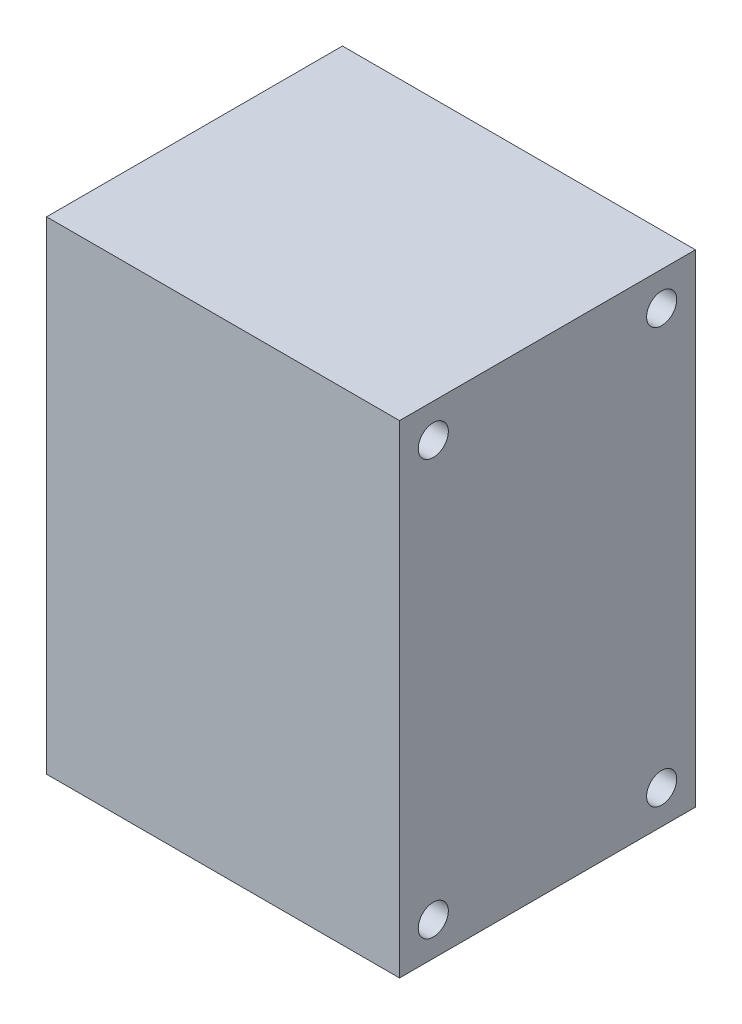
ISO-10303-21;
HEADER;
FILE_DESCRIPTION(('STEP AP214'),'2;1');
FILE_NAME('part.step','',(''),(''),'','','');
FILE_SCHEMA(('AUTOMOTIVE_DESIGN { 1 0 10303 214 1 1 1 1 }'));
ENDSEC;
DATA;
#1=APPLICATION_CONTEXT('core data for automotive mechanical design processes');
#2=APPLICATION_PROTOCOL_DEFINITION('international standard','automotive_design',2000,#1);
#3=PRODUCT_CONTEXT('',#1,'mechanical');
#4=PRODUCT('Part','Part','',(#3));
#5=PRODUCT_RELATED_PRODUCT_CATEGORY('part','',(#4));
#6=PRODUCT_DEFINITION_FORMATION('','',#4);
#7=PRODUCT_DEFINITION_CONTEXT('part definition',#1,'design');
#8=PRODUCT_DEFINITION('design','',#6,#7);
#9=PRODUCT_DEFINITION_SHAPE('','',#8);
#10=(LENGTH_UNIT() NAMED_UNIT(*) SI_UNIT(.MILLI.,.METRE.));
#11=(NAMED_UNIT(*) PLANE_ANGLE_UNIT() SI_UNIT($,.RADIAN.));
#12=(NAMED_UNIT(*) SI_UNIT($,.STERADIAN.) SOLID_ANGLE_UNIT());
#13=UNCERTAINTY_MEASURE_WITH_UNIT(LENGTH_MEASURE(1.E-05),#10,'distance_accuracy_value','');
#14=(GEOMETRIC_REPRESENTATION_CONTEXT(3) GLOBAL_UNCERTAINTY_ASSIGNED_CONTEXT((#13)) GLOBAL_UNIT_ASSIGNED_CONTEXT((#10,
#11,#12)) REPRESENTATION_CONTEXT('',''));
#15=CARTESIAN_POINT('',(0.,0.,0.));
#16=DIRECTION('',(0.,0.,1.));
#17=DIRECTION('',(1.,0.,0.));
#18=AXIS2_PLACEMENT_3D('',#15,#16,#17);
#19=CARTESIAN_POINT('',(17.,23.25,28.5));
#20=DIRECTION('',(-1.,0.,0.));
#21=DIRECTION('',(0.,-1.,0.));
#22=AXIS2_PLACEMENT_3D('',#19,#20,#21);
#23=PLANE('',#22);
#24=CARTESIAN_POINT('',(17.,-20.,25.2499999999996));
#25=DIRECTION('',(1.,0.,0.));
#26=DIRECTION('',(0.,1.,0.));
#27=AXIS2_PLACEMENT_3D('',#24,#25,#26);
#28=CIRCLE('',#27,1.45);
#29=CARTESIAN_POINT('',(17.,-18.55,25.2499999999996));
#30=VERTEX_POINT('',#29);
#31=EDGE_CURVE('E146',#30,#30,#28,.T.);
#32=ORIENTED_EDGE('',*,*,#31,.F.);
#33=EDGE_LOOP('',(#32));
#34=FACE_BOUND('',#33,.T.);
#35=CARTESIAN_POINT('',(17.,-20.,3.24999999999959));
#36=DIRECTION('',(1.,0.,0.));
#37=DIRECTION('',(0.,1.,0.));
#38=AXIS2_PLACEMENT_3D('',#35,#36,#37);
#39=CIRCLE('',#38,1.45);
#40=CARTESIAN_POINT('',(17.,-18.55,3.24999999999959));
#41=VERTEX_POINT('',#40);
#42=EDGE_CURVE('E154',#41,#41,#39,.T.);
#43=ORIENTED_EDGE('',*,*,#42,.F.);
#44=EDGE_LOOP('',(#43));
#45=FACE_BOUND('',#44,.T.);
#46=CARTESIAN_POINT('',(17.,20.,3.25));
#47=DIRECTION('',(1.,0.,0.));
#48=DIRECTION('',(0.,1.,0.));
#49=AXIS2_PLACEMENT_3D('',#46,#47,#48);
#50=CIRCLE('',#49,1.45);
#51=CARTESIAN_POINT('',(17.,21.45,3.25));
#52=VERTEX_POINT('',#51);
#53=EDGE_CURVE('E138',#52,#52,#50,.T.);
#54=ORIENTED_EDGE('',*,*,#53,.F.);
#55=EDGE_LOOP('',(#54));
#56=FACE_BOUND('',#55,.T.);
#57=CARTESIAN_POINT('',(17.,20.,25.25));
#58=DIRECTION('',(1.,0.,0.));
#59=DIRECTION('',(0.,1.,0.));
#60=AXIS2_PLACEMENT_3D('',#57,#58,#59);
#61=CIRCLE('',#60,1.45);
#62=CARTESIAN_POINT('',(17.,21.45,25.25));
#63=VERTEX_POINT('',#62);
#64=EDGE_CURVE('E134',#63,#63,#61,.T.);
#65=ORIENTED_EDGE('',*,*,#64,.F.);
#66=EDGE_LOOP('',(#65));
#67=FACE_BOUND('',#66,.T.);
#68=DIRECTION('',(0.,1.,0.));
#69=VECTOR('',#68,1.);
#70=CARTESIAN_POINT('',(17.,23.25,0.));
#71=LINE('',#70,#69);
#72=CARTESIAN_POINT('',(17.,-23.25,0.));
#73=VERTEX_POINT('',#72);
#74=CARTESIAN_POINT('',(17.,23.25,0.));
#75=VERTEX_POINT('',#74);
#76=EDGE_CURVE('E113',#73,#75,#71,.T.);
#77=ORIENTED_EDGE('',*,*,#76,.T.);
#78=DIRECTION('',(0.,0.,-1.));
#79=VECTOR('',#78,1.);
#80=CARTESIAN_POINT('',(17.,23.25,28.5));
#81=LINE('',#80,#79);
#82=CARTESIAN_POINT('',(17.,23.25,28.5));
#83=VERTEX_POINT('',#82);
#84=EDGE_CURVE('E11',#83,#75,#81,.T.);
#85=ORIENTED_EDGE('',*,*,#84,.F.);
#86=DIRECTION('',(0.,1.,0.));
#87=VECTOR('',#86,1.);
#88=CARTESIAN_POINT('',(17.,23.25,28.5));
#89=LINE('',#88,#87);
#90=CARTESIAN_POINT('',(17.,-23.25,28.5));
#91=VERTEX_POINT('',#90);
#92=EDGE_CURVE('E97',#91,#83,#89,.T.);
#93=ORIENTED_EDGE('',*,*,#92,.F.);
#94=DIRECTION('',(0.,0.,-1.));
#95=VECTOR('',#94,1.);
#96=CARTESIAN_POINT('',(17.,-23.25,28.5));
#97=LINE('',#96,#95);
#98=EDGE_CURVE('E109',#91,#73,#97,.T.);
#99=ORIENTED_EDGE('',*,*,#98,.T.);
#100=EDGE_LOOP('',(#77,#85,#93,#99));
#101=FACE_BOUND('',#100,.T.);
#102=ADVANCED_FACE('F45',(#34,#45,#56,#67,#101),#23,.F.);
#103=CARTESIAN_POINT('',(-17.,23.25,28.5));
#104=DIRECTION('',(0.,-1.,0.));
#105=DIRECTION('',(0.,0.,-1.));
#106=AXIS2_PLACEMENT_3D('',#103,#104,#105);
#107=PLANE('',#106);
#108=DIRECTION('',(-1.,0.,0.));
#109=VECTOR('',#108,1.);
#110=CARTESIAN_POINT('',(-17.,23.25,0.));
#111=LINE('',#110,#109);
#112=CARTESIAN_POINT('',(-17.,23.25,0.));
#113=VERTEX_POINT('',#112);
#114=EDGE_CURVE('E102',#75,#113,#111,.T.);
#115=ORIENTED_EDGE('',*,*,#114,.T.);
#116=DIRECTION('',(0.,0.,-1.));
#117=VECTOR('',#116,1.);
#118=CARTESIAN_POINT('',(-17.,23.25,28.5));
#119=LINE('',#118,#117);
#120=CARTESIAN_POINT('',(-17.,23.25,28.5));
#121=VERTEX_POINT('',#120);
#122=EDGE_CURVE('E54',#121,#113,#119,.T.);
#123=ORIENTED_EDGE('',*,*,#122,.F.);
#124=DIRECTION('',(-1.,0.,0.));
#125=VECTOR('',#124,1.);
#126=CARTESIAN_POINT('',(-17.,23.25,28.5));
#127=LINE('',#126,#125);
#128=EDGE_CURVE('E92',#83,#121,#127,.T.);
#129=ORIENTED_EDGE('',*,*,#128,.F.);
#130=ORIENTED_EDGE('',*,*,#84,.T.);
#131=EDGE_LOOP('',(#115,#123,#129,#130));
#132=FACE_BOUND('',#131,.T.);
#133=ADVANCED_FACE('F101',(#132),#107,.F.);
#134=CARTESIAN_POINT('',(-17.,23.25,28.5));
#135=DIRECTION('',(1.,0.,0.));
#136=DIRECTION('',(0.,1.,0.));
#137=AXIS2_PLACEMENT_3D('',#134,#135,#136);
#138=PLANE('',#137);
#139=CARTESIAN_POINT('',(-17.,-20.,25.2499999999996));
#140=DIRECTION('',(1.,0.,0.));
#141=DIRECTION('',(0.,1.,0.));
#142=AXIS2_PLACEMENT_3D('',#139,#140,#141);
#143=CIRCLE('',#142,1.45);
#144=CARTESIAN_POINT('',(-17.,-18.55,25.2499999999996));
#145=VERTEX_POINT('',#144);
#146=EDGE_CURVE('E142',#145,#145,#143,.T.);
#147=ORIENTED_EDGE('',*,*,#146,.T.);
#148=EDGE_LOOP('',(#147));
#149=FACE_BOUND('',#148,.T.);
#150=CARTESIAN_POINT('',(-17.,-20.,3.24999999999959));
#151=DIRECTION('',(1.,0.,0.));
#152=DIRECTION('',(0.,1.,0.));
#153=AXIS2_PLACEMENT_3D('',#150,#151,#152);
#154=CIRCLE('',#153,1.45);
#155=CARTESIAN_POINT('',(-17.,-18.55,3.24999999999959));
#156=VERTEX_POINT('',#155);
#157=EDGE_CURVE('E150',#156,#156,#154,.T.);
#158=ORIENTED_EDGE('',*,*,#157,.T.);
#159=EDGE_LOOP('',(#158));
#160=FACE_BOUND('',#159,.T.);
#161=CARTESIAN_POINT('',(-17.,20.,3.25));
#162=DIRECTION('',(1.,0.,0.));
#163=DIRECTION('',(0.,1.,0.));
#164=AXIS2_PLACEMENT_3D('',#161,#162,#163);
#165=CIRCLE('',#164,1.45);
#166=CARTESIAN_POINT('',(-17.,21.45,3.25));
#167=VERTEX_POINT('',#166);
#168=EDGE_CURVE('E158',#167,#167,#165,.T.);
#169=ORIENTED_EDGE('',*,*,#168,.T.);
#170=EDGE_LOOP('',(#169));
#171=FACE_BOUND('',#170,.T.);
#172=CARTESIAN_POINT('',(-17.,20.,25.25));
#173=DIRECTION('',(1.,0.,0.));
#174=DIRECTION('',(0.,1.,0.));
#175=AXIS2_PLACEMENT_3D('',#172,#173,#174);
#176=CIRCLE('',#175,1.45);
#177=CARTESIAN_POINT('',(-17.,21.45,25.25));
#178=VERTEX_POINT('',#177);
#179=EDGE_CURVE('E117',#178,#178,#176,.T.);
#180=ORIENTED_EDGE('',*,*,#179,.T.);
#181=EDGE_LOOP('',(#180));
#182=FACE_BOUND('',#181,.T.);
#183=DIRECTION('',(0.,-1.,0.));
#184=VECTOR('',#183,1.);
#185=CARTESIAN_POINT('',(-17.,23.25,0.));
#186=LINE('',#185,#184);
#187=CARTESIAN_POINT('',(-17.,-23.25,0.));
#188=VERTEX_POINT('',#187);
#189=EDGE_CURVE('E79',#113,#188,#186,.T.);
#190=ORIENTED_EDGE('',*,*,#189,.T.);
#191=DIRECTION('',(0.,0.,-1.));
#192=VECTOR('',#191,1.);
#193=CARTESIAN_POINT('',(-17.,-23.25,28.5));
#194=LINE('',#193,#192);
#195=CARTESIAN_POINT('',(-17.,-23.25,28.5));
#196=VERTEX_POINT('',#195);
#197=EDGE_CURVE('E104',#196,#188,#194,.T.);
#198=ORIENTED_EDGE('',*,*,#197,.F.);
#199=DIRECTION('',(0.,-1.,0.));
#200=VECTOR('',#199,1.);
#201=CARTESIAN_POINT('',(-17.,23.25,28.5));
#202=LINE('',#201,#200);
#203=EDGE_CURVE('E95',#121,#196,#202,.T.);
#204=ORIENTED_EDGE('',*,*,#203,.F.);
#205=ORIENTED_EDGE('',*,*,#122,.T.);
#206=EDGE_LOOP('',(#190,#198,#204,#205));
#207=FACE_BOUND('',#206,.T.);
#208=ADVANCED_FACE('F105',(#149,#160,#171,#182,#207),#138,.F.);
#209=CARTESIAN_POINT('',(-17.,-23.25,28.5));
#210=DIRECTION('',(0.,1.,0.));
#211=DIRECTION('',(0.,0.,1.));
#212=AXIS2_PLACEMENT_3D('',#209,#210,#211);
#213=PLANE('',#212);
#214=DIRECTION('',(1.,0.,0.));
#215=VECTOR('',#214,1.);
#216=CARTESIAN_POINT('',(-17.,-23.25,0.));
#217=LINE('',#216,#215);
#218=EDGE_CURVE('E85',#188,#73,#217,.T.);
#219=ORIENTED_EDGE('',*,*,#218,.T.);
#220=ORIENTED_EDGE('',*,*,#98,.F.);
#221=DIRECTION('',(1.,0.,0.));
#222=VECTOR('',#221,1.);
#223=CARTESIAN_POINT('',(-17.,-23.25,28.5));
#224=LINE('',#223,#222);
#225=EDGE_CURVE('E62',#196,#91,#224,.T.);
#226=ORIENTED_EDGE('',*,*,#225,.F.);
#227=ORIENTED_EDGE('',*,*,#197,.T.);
#228=EDGE_LOOP('',(#219,#220,#226,#227));
#229=FACE_BOUND('',#228,.T.);
#230=ADVANCED_FACE('F127',(#229),#213,.F.);
#231=CARTESIAN_POINT('',(0.,0.,28.5));
#232=DIRECTION('',(0.,0.,1.));
#233=DIRECTION('',(1.,0.,0.));
#234=AXIS2_PLACEMENT_3D('',#231,#232,#233);
#235=PLANE('',#234);
#236=ORIENTED_EDGE('',*,*,#92,.T.);
#237=ORIENTED_EDGE('',*,*,#128,.T.);
#238=ORIENTED_EDGE('',*,*,#203,.T.);
#239=ORIENTED_EDGE('',*,*,#225,.T.);
#240=EDGE_LOOP('',(#236,#237,#238,#239));
#241=FACE_BOUND('',#240,.T.);
#242=ADVANCED_FACE('F93',(#241),#235,.T.);
#243=CARTESIAN_POINT('',(0.,0.,0.));
#244=DIRECTION('',(0.,0.,1.));
#245=DIRECTION('',(1.,0.,0.));
#246=AXIS2_PLACEMENT_3D('',#243,#244,#245);
#247=PLANE('',#246);
#248=ORIENTED_EDGE('',*,*,#76,.F.);
#249=ORIENTED_EDGE('',*,*,#218,.F.);
#250=ORIENTED_EDGE('',*,*,#189,.F.);
#251=ORIENTED_EDGE('',*,*,#114,.F.);
#252=EDGE_LOOP('',(#248,#249,#250,#251));
#253=FACE_BOUND('',#252,.T.);
#254=ADVANCED_FACE('F130',(#253),#247,.F.);
#255=CARTESIAN_POINT('',(-17.,20.,25.25));
#256=DIRECTION('',(1.,0.,0.));
#257=DIRECTION('',(0.,1.,0.));
#258=AXIS2_PLACEMENT_3D('',#255,#256,#257);
#259=CYLINDRICAL_SURFACE('',#258,1.45);
#260=ORIENTED_EDGE('',*,*,#179,.F.);
#261=EDGE_LOOP('',(#260));
#262=FACE_BOUND('',#261,.T.);
#263=ORIENTED_EDGE('',*,*,#64,.T.);
#264=EDGE_LOOP('',(#263));
#265=FACE_BOUND('',#264,.T.);
#266=ADVANCED_FACE('F173',(#262,#265),#259,.F.);
#267=CARTESIAN_POINT('',(-17.,20.,3.25));
#268=DIRECTION('',(1.,0.,0.));
#269=DIRECTION('',(0.,1.,0.));
#270=AXIS2_PLACEMENT_3D('',#267,#268,#269);
#271=CYLINDRICAL_SURFACE('',#270,1.45);
#272=ORIENTED_EDGE('',*,*,#168,.F.);
#273=EDGE_LOOP('',(#272));
#274=FACE_BOUND('',#273,.T.);
#275=ORIENTED_EDGE('',*,*,#53,.T.);
#276=EDGE_LOOP('',(#275));
#277=FACE_BOUND('',#276,.T.);
#278=ADVANCED_FACE('F166',(#274,#277),#271,.F.);
#279=CARTESIAN_POINT('',(-17.,-20.,3.24999999999959));
#280=DIRECTION('',(1.,0.,0.));
#281=DIRECTION('',(0.,1.,0.));
#282=AXIS2_PLACEMENT_3D('',#279,#280,#281);
#283=CYLINDRICAL_SURFACE('',#282,1.45);
#284=ORIENTED_EDGE('',*,*,#157,.F.);
#285=EDGE_LOOP('',(#284));
#286=FACE_BOUND('',#285,.T.);
#287=ORIENTED_EDGE('',*,*,#42,.T.);
#288=EDGE_LOOP('',(#287));
#289=FACE_BOUND('',#288,.T.);
#290=ADVANCED_FACE('F181',(#286,#289),#283,.F.);
#291=CARTESIAN_POINT('',(-17.,-20.,25.2499999999996));
#292=DIRECTION('',(1.,0.,0.));
#293=DIRECTION('',(0.,1.,0.));
#294=AXIS2_PLACEMENT_3D('',#291,#292,#293);
#295=CYLINDRICAL_SURFACE('',#294,1.45);
#296=ORIENTED_EDGE('',*,*,#146,.F.);
#297=EDGE_LOOP('',(#296));
#298=FACE_BOUND('',#297,.T.);
#299=ORIENTED_EDGE('',*,*,#31,.T.);
#300=EDGE_LOOP('',(#299));
#301=FACE_BOUND('',#300,.T.);
#302=ADVANCED_FACE('F189',(#298,#301),#295,.F.);
#303=CLOSED_SHELL('',(#102,#133,#208,#230,#242,#254,#266,#278,#290,#302));
#304=MANIFOLD_SOLID_BREP('B2',#303);
#305=ADVANCED_BREP_SHAPE_REPRESENTATION('',(#18,#304),#14);
#306=SHAPE_DEFINITION_REPRESENTATION(#9,#305);
ENDSEC;
END-ISO-10303-21;
